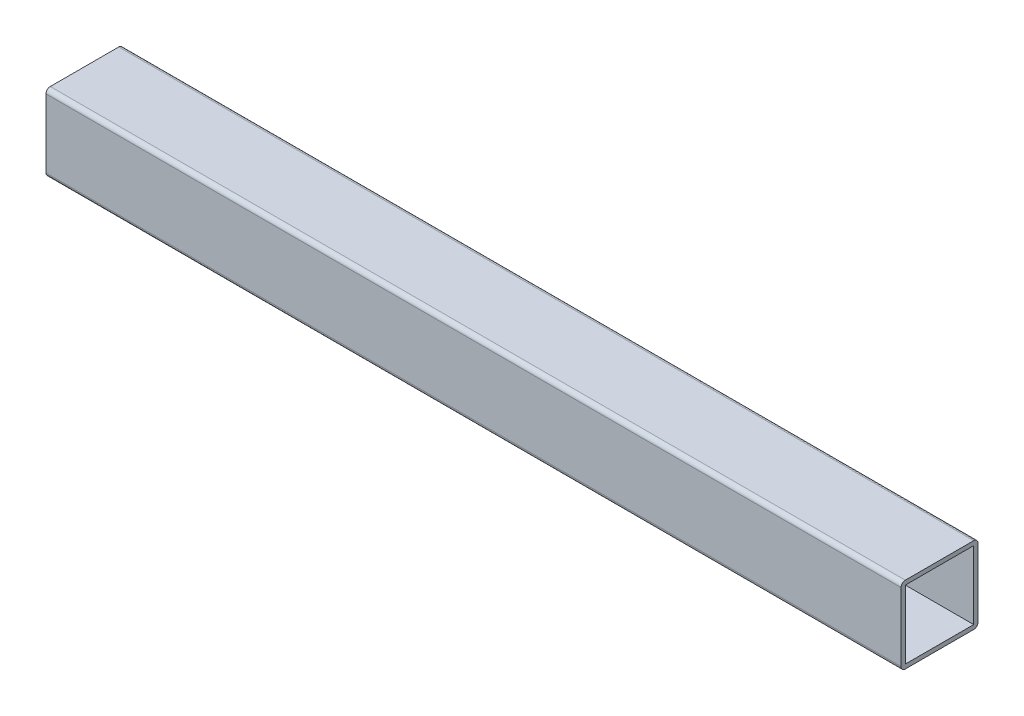
ISO-10303-21;
HEADER;
FILE_DESCRIPTION(('STEP AP214'),'2;1');
FILE_NAME('part.step','',(''),(''),'','','');
FILE_SCHEMA(('AUTOMOTIVE_DESIGN { 1 0 10303 214 1 1 1 1 }'));
ENDSEC;
DATA;
#1=APPLICATION_CONTEXT('core data for automotive mechanical design processes');
#2=APPLICATION_PROTOCOL_DEFINITION('international standard','automotive_design',2000,#1);
#3=PRODUCT_CONTEXT('',#1,'mechanical');
#4=PRODUCT('Part','Part','',(#3));
#5=PRODUCT_RELATED_PRODUCT_CATEGORY('part','',(#4));
#6=PRODUCT_DEFINITION_FORMATION('','',#4);
#7=PRODUCT_DEFINITION_CONTEXT('part definition',#1,'design');
#8=PRODUCT_DEFINITION('design','',#6,#7);
#9=PRODUCT_DEFINITION_SHAPE('','',#8);
#10=(LENGTH_UNIT() NAMED_UNIT(*) SI_UNIT(.MILLI.,.METRE.));
#11=(NAMED_UNIT(*) PLANE_ANGLE_UNIT() SI_UNIT($,.RADIAN.));
#12=(NAMED_UNIT(*) SI_UNIT($,.STERADIAN.) SOLID_ANGLE_UNIT());
#13=UNCERTAINTY_MEASURE_WITH_UNIT(LENGTH_MEASURE(1.E-05),#10,'distance_accuracy_value','');
#14=(GEOMETRIC_REPRESENTATION_CONTEXT(3) GLOBAL_UNCERTAINTY_ASSIGNED_CONTEXT((#13)) GLOBAL_UNIT_ASSIGNED_CONTEXT((#10,
#11,#12)) REPRESENTATION_CONTEXT('',''));
#15=CARTESIAN_POINT('',(0.,0.,0.));
#16=DIRECTION('',(0.,0.,1.));
#17=DIRECTION('',(1.,0.,0.));
#18=AXIS2_PLACEMENT_3D('',#15,#16,#17);
#19=CARTESIAN_POINT('',(2000.,170.,-10.));
#20=DIRECTION('',(-1.,0.,0.));
#21=DIRECTION('',(0.,0.,1.));
#22=AXIS2_PLACEMENT_3D('',#19,#20,#21);
#23=PLANE('',#22);
#24=CARTESIAN_POINT('',(2000.,170.,-10.));
#25=DIRECTION('',(1.,0.,0.));
#26=DIRECTION('',(0.,0.,1.));
#27=AXIS2_PLACEMENT_3D('',#24,#25,#26);
#28=CIRCLE('',#27,10.);
#29=CARTESIAN_POINT('',(2000.,180.,-10.));
#30=VERTEX_POINT('',#29);
#31=CARTESIAN_POINT('',(2000.,170.,0.));
#32=VERTEX_POINT('',#31);
#33=EDGE_CURVE('E173',#30,#32,#28,.T.);
#34=ORIENTED_EDGE('',*,*,#33,.T.);
#35=DIRECTION('',(0.,-1.,0.));
#36=VECTOR('',#35,1.);
#37=CARTESIAN_POINT('',(2000.,10.0000000000001,0.));
#38=LINE('',#37,#36);
#39=CARTESIAN_POINT('',(2000.,10.0000000000001,0.));
#40=VERTEX_POINT('',#39);
#41=EDGE_CURVE('E176',#32,#40,#38,.T.);
#42=ORIENTED_EDGE('',*,*,#41,.T.);
#43=CARTESIAN_POINT('',(2000.,10.,-10.));
#44=DIRECTION('',(1.,0.,0.));
#45=DIRECTION('',(0.,0.,1.));
#46=AXIS2_PLACEMENT_3D('',#43,#44,#45);
#47=CIRCLE('',#46,10.);
#48=CARTESIAN_POINT('',(2000.,0.,-10.0000000000001));
#49=VERTEX_POINT('',#48);
#50=EDGE_CURVE('E178',#40,#49,#47,.T.);
#51=ORIENTED_EDGE('',*,*,#50,.T.);
#52=DIRECTION('',(0.,0.,-1.));
#53=VECTOR('',#52,1.);
#54=CARTESIAN_POINT('',(2000.,0.,-10.0000000000001));
#55=LINE('',#54,#53);
#56=CARTESIAN_POINT('',(2000.,0.,-170.));
#57=VERTEX_POINT('',#56);
#58=EDGE_CURVE('E180',#49,#57,#55,.T.);
#59=ORIENTED_EDGE('',*,*,#58,.T.);
#60=CARTESIAN_POINT('',(2000.,10.,-170.));
#61=DIRECTION('',(1.,0.,0.));
#62=DIRECTION('',(0.,0.,-1.));
#63=AXIS2_PLACEMENT_3D('',#60,#61,#62);
#64=CIRCLE('',#63,10.);
#65=CARTESIAN_POINT('',(2000.,10.,-180.));
#66=VERTEX_POINT('',#65);
#67=EDGE_CURVE('E182',#57,#66,#64,.T.);
#68=ORIENTED_EDGE('',*,*,#67,.T.);
#69=DIRECTION('',(0.,1.,0.));
#70=VECTOR('',#69,1.);
#71=CARTESIAN_POINT('',(2000.,10.,-180.));
#72=LINE('',#71,#70);
#73=CARTESIAN_POINT('',(2000.,170.,-180.));
#74=VERTEX_POINT('',#73);
#75=EDGE_CURVE('E184',#66,#74,#72,.T.);
#76=ORIENTED_EDGE('',*,*,#75,.T.);
#77=CARTESIAN_POINT('',(2000.,170.,-170.));
#78=DIRECTION('',(1.,0.,0.));
#79=DIRECTION('',(0.,0.,-1.));
#80=AXIS2_PLACEMENT_3D('',#77,#78,#79);
#81=CIRCLE('',#80,10.);
#82=CARTESIAN_POINT('',(2000.,180.,-170.));
#83=VERTEX_POINT('',#82);
#84=EDGE_CURVE('E186',#74,#83,#81,.T.);
#85=ORIENTED_EDGE('',*,*,#84,.T.);
#86=DIRECTION('',(0.,0.,1.));
#87=VECTOR('',#86,1.);
#88=CARTESIAN_POINT('',(2000.,180.,-10.));
#89=LINE('',#88,#87);
#90=EDGE_CURVE('E188',#83,#30,#89,.T.);
#91=ORIENTED_EDGE('',*,*,#90,.T.);
#92=EDGE_LOOP('',(#34,#42,#51,#59,#68,#76,#85,#91));
#93=FACE_BOUND('',#92,.T.);
#94=DIRECTION('',(0.,0.,-1.));
#95=VECTOR('',#94,1.);
#96=CARTESIAN_POINT('',(2000.,10.,-10.));
#97=LINE('',#96,#95);
#98=CARTESIAN_POINT('',(2000.,10.,-10.));
#99=VERTEX_POINT('',#98);
#100=CARTESIAN_POINT('',(2000.,10.,-170.));
#101=VERTEX_POINT('',#100);
#102=EDGE_CURVE('E136',#99,#101,#97,.T.);
#103=ORIENTED_EDGE('',*,*,#102,.F.);
#104=DIRECTION('',(0.,-1.,0.));
#105=VECTOR('',#104,1.);
#106=CARTESIAN_POINT('',(2000.,10.,-10.));
#107=LINE('',#106,#105);
#108=CARTESIAN_POINT('',(2000.,170.,-10.));
#109=VERTEX_POINT('',#108);
#110=EDGE_CURVE('E151',#109,#99,#107,.T.);
#111=ORIENTED_EDGE('',*,*,#110,.F.);
#112=DIRECTION('',(0.,0.,1.));
#113=VECTOR('',#112,1.);
#114=CARTESIAN_POINT('',(2000.,170.,-10.));
#115=LINE('',#114,#113);
#116=CARTESIAN_POINT('',(2000.,170.,-170.));
#117=VERTEX_POINT('',#116);
#118=EDGE_CURVE('E149',#117,#109,#115,.T.);
#119=ORIENTED_EDGE('',*,*,#118,.F.);
#120=DIRECTION('',(0.,1.,0.));
#121=VECTOR('',#120,1.);
#122=CARTESIAN_POINT('',(2000.,10.,-170.));
#123=LINE('',#122,#121);
#124=EDGE_CURVE('E147',#101,#117,#123,.T.);
#125=ORIENTED_EDGE('',*,*,#124,.F.);
#126=EDGE_LOOP('',(#103,#111,#119,#125));
#127=FACE_BOUND('',#126,.T.);
#128=ADVANCED_FACE('F32',(#93,#127),#23,.F.);
#129=CARTESIAN_POINT('',(0.,170.,-10.));
#130=DIRECTION('',(-1.,0.,0.));
#131=DIRECTION('',(0.,0.,1.));
#132=AXIS2_PLACEMENT_3D('',#129,#130,#131);
#133=PLANE('',#132);
#134=CARTESIAN_POINT('',(0.,170.,-10.));
#135=DIRECTION('',(1.,0.,0.));
#136=DIRECTION('',(0.,0.,1.));
#137=AXIS2_PLACEMENT_3D('',#134,#135,#136);
#138=CIRCLE('',#137,10.);
#139=CARTESIAN_POINT('',(0.,180.,-10.));
#140=VERTEX_POINT('',#139);
#141=CARTESIAN_POINT('',(0.,170.,0.));
#142=VERTEX_POINT('',#141);
#143=EDGE_CURVE('E137',#140,#142,#138,.T.);
#144=ORIENTED_EDGE('',*,*,#143,.F.);
#145=DIRECTION('',(0.,0.,1.));
#146=VECTOR('',#145,1.);
#147=CARTESIAN_POINT('',(0.,180.,-10.));
#148=LINE('',#147,#146);
#149=CARTESIAN_POINT('',(0.,180.,-170.));
#150=VERTEX_POINT('',#149);
#151=EDGE_CURVE('E171',#150,#140,#148,.T.);
#152=ORIENTED_EDGE('',*,*,#151,.F.);
#153=CARTESIAN_POINT('',(0.,170.,-170.));
#154=DIRECTION('',(1.,0.,0.));
#155=DIRECTION('',(0.,0.,-1.));
#156=AXIS2_PLACEMENT_3D('',#153,#154,#155);
#157=CIRCLE('',#156,10.);
#158=CARTESIAN_POINT('',(0.,170.,-180.));
#159=VERTEX_POINT('',#158);
#160=EDGE_CURVE('E169',#159,#150,#157,.T.);
#161=ORIENTED_EDGE('',*,*,#160,.F.);
#162=DIRECTION('',(0.,1.,0.));
#163=VECTOR('',#162,1.);
#164=CARTESIAN_POINT('',(0.,10.,-180.));
#165=LINE('',#164,#163);
#166=CARTESIAN_POINT('',(0.,10.,-180.));
#167=VERTEX_POINT('',#166);
#168=EDGE_CURVE('E167',#167,#159,#165,.T.);
#169=ORIENTED_EDGE('',*,*,#168,.F.);
#170=CARTESIAN_POINT('',(0.,10.,-170.));
#171=DIRECTION('',(1.,0.,0.));
#172=DIRECTION('',(0.,0.,-1.));
#173=AXIS2_PLACEMENT_3D('',#170,#171,#172);
#174=CIRCLE('',#173,10.);
#175=CARTESIAN_POINT('',(0.,0.,-170.));
#176=VERTEX_POINT('',#175);
#177=EDGE_CURVE('E165',#176,#167,#174,.T.);
#178=ORIENTED_EDGE('',*,*,#177,.F.);
#179=DIRECTION('',(0.,0.,-1.));
#180=VECTOR('',#179,1.);
#181=CARTESIAN_POINT('',(0.,0.,-10.0000000000001));
#182=LINE('',#181,#180);
#183=CARTESIAN_POINT('',(0.,0.,-10.0000000000001));
#184=VERTEX_POINT('',#183);
#185=EDGE_CURVE('E163',#184,#176,#182,.T.);
#186=ORIENTED_EDGE('',*,*,#185,.F.);
#187=CARTESIAN_POINT('',(0.,10.,-10.));
#188=DIRECTION('',(1.,0.,0.));
#189=DIRECTION('',(0.,0.,1.));
#190=AXIS2_PLACEMENT_3D('',#187,#188,#189);
#191=CIRCLE('',#190,10.);
#192=CARTESIAN_POINT('',(0.,10.0000000000001,0.));
#193=VERTEX_POINT('',#192);
#194=EDGE_CURVE('E161',#193,#184,#191,.T.);
#195=ORIENTED_EDGE('',*,*,#194,.F.);
#196=DIRECTION('',(0.,-1.,0.));
#197=VECTOR('',#196,1.);
#198=CARTESIAN_POINT('',(0.,10.0000000000001,0.));
#199=LINE('',#198,#197);
#200=EDGE_CURVE('E159',#142,#193,#199,.T.);
#201=ORIENTED_EDGE('',*,*,#200,.F.);
#202=EDGE_LOOP('',(#144,#152,#161,#169,#178,#186,#195,#201));
#203=FACE_BOUND('',#202,.T.);
#204=DIRECTION('',(0.,-1.,0.));
#205=VECTOR('',#204,1.);
#206=CARTESIAN_POINT('',(0.,10.,-10.));
#207=LINE('',#206,#205);
#208=CARTESIAN_POINT('',(0.,170.,-10.));
#209=VERTEX_POINT('',#208);
#210=CARTESIAN_POINT('',(0.,10.,-10.));
#211=VERTEX_POINT('',#210);
#212=EDGE_CURVE('E141',#209,#211,#207,.T.);
#213=ORIENTED_EDGE('',*,*,#212,.T.);
#214=DIRECTION('',(0.,0.,-1.));
#215=VECTOR('',#214,1.);
#216=CARTESIAN_POINT('',(0.,10.,-10.));
#217=LINE('',#216,#215);
#218=CARTESIAN_POINT('',(0.,10.,-170.));
#219=VERTEX_POINT('',#218);
#220=EDGE_CURVE('E55',#211,#219,#217,.T.);
#221=ORIENTED_EDGE('',*,*,#220,.T.);
#222=DIRECTION('',(0.,1.,0.));
#223=VECTOR('',#222,1.);
#224=CARTESIAN_POINT('',(0.,10.,-170.));
#225=LINE('',#224,#223);
#226=CARTESIAN_POINT('',(0.,170.,-170.));
#227=VERTEX_POINT('',#226);
#228=EDGE_CURVE('E123',#219,#227,#225,.T.);
#229=ORIENTED_EDGE('',*,*,#228,.T.);
#230=DIRECTION('',(0.,0.,1.));
#231=VECTOR('',#230,1.);
#232=CARTESIAN_POINT('',(0.,170.,-10.));
#233=LINE('',#232,#231);
#234=EDGE_CURVE('E132',#227,#209,#233,.T.);
#235=ORIENTED_EDGE('',*,*,#234,.T.);
#236=EDGE_LOOP('',(#213,#221,#229,#235));
#237=FACE_BOUND('',#236,.T.);
#238=ADVANCED_FACE('F140',(#203,#237),#133,.T.);
#239=CARTESIAN_POINT('',(2000.,170.,-10.));
#240=DIRECTION('',(-1.,0.,0.));
#241=DIRECTION('',(0.,0.,1.));
#242=AXIS2_PLACEMENT_3D('',#239,#240,#241);
#243=CYLINDRICAL_SURFACE('',#242,10.);
#244=ORIENTED_EDGE('',*,*,#143,.T.);
#245=DIRECTION('',(-1.,0.,0.));
#246=VECTOR('',#245,1.);
#247=CARTESIAN_POINT('',(2000.,170.,0.));
#248=LINE('',#247,#246);
#249=EDGE_CURVE('E11',#32,#142,#248,.T.);
#250=ORIENTED_EDGE('',*,*,#249,.F.);
#251=ORIENTED_EDGE('',*,*,#33,.F.);
#252=DIRECTION('',(-1.,0.,0.));
#253=VECTOR('',#252,1.);
#254=CARTESIAN_POINT('',(2000.,180.,-10.));
#255=LINE('',#254,#253);
#256=EDGE_CURVE('E190',#30,#140,#255,.T.);
#257=ORIENTED_EDGE('',*,*,#256,.T.);
#258=EDGE_LOOP('',(#244,#250,#251,#257));
#259=FACE_BOUND('',#258,.T.);
#260=ADVANCED_FACE('F34',(#259),#243,.T.);
#261=CARTESIAN_POINT('',(2000.,10.0000000000001,0.));
#262=DIRECTION('',(0.,0.,-1.));
#263=DIRECTION('',(-1.,0.,0.));
#264=AXIS2_PLACEMENT_3D('',#261,#262,#263);
#265=PLANE('',#264);
#266=ORIENTED_EDGE('',*,*,#200,.T.);
#267=DIRECTION('',(-1.,0.,0.));
#268=VECTOR('',#267,1.);
#269=CARTESIAN_POINT('',(2000.,10.0000000000001,0.));
#270=LINE('',#269,#268);
#271=EDGE_CURVE('E40',#40,#193,#270,.T.);
#272=ORIENTED_EDGE('',*,*,#271,.F.);
#273=ORIENTED_EDGE('',*,*,#41,.F.);
#274=ORIENTED_EDGE('',*,*,#249,.T.);
#275=EDGE_LOOP('',(#266,#272,#273,#274));
#276=FACE_BOUND('',#275,.T.);
#277=ADVANCED_FACE('F234',(#276),#265,.F.);
#278=CARTESIAN_POINT('',(2000.,10.,-10.));
#279=DIRECTION('',(-1.,0.,0.));
#280=DIRECTION('',(0.,0.,1.));
#281=AXIS2_PLACEMENT_3D('',#278,#279,#280);
#282=CYLINDRICAL_SURFACE('',#281,10.);
#283=ORIENTED_EDGE('',*,*,#194,.T.);
#284=DIRECTION('',(-1.,0.,0.));
#285=VECTOR('',#284,1.);
#286=CARTESIAN_POINT('',(2000.,0.,-10.0000000000001));
#287=LINE('',#286,#285);
#288=EDGE_CURVE('E205',#49,#184,#287,.T.);
#289=ORIENTED_EDGE('',*,*,#288,.F.);
#290=ORIENTED_EDGE('',*,*,#50,.F.);
#291=ORIENTED_EDGE('',*,*,#271,.T.);
#292=EDGE_LOOP('',(#283,#289,#290,#291));
#293=FACE_BOUND('',#292,.T.);
#294=ADVANCED_FACE('F212',(#293),#282,.T.);
#295=CARTESIAN_POINT('',(2000.,0.,-10.0000000000001));
#296=DIRECTION('',(0.,1.,0.));
#297=DIRECTION('',(0.,0.,1.));
#298=AXIS2_PLACEMENT_3D('',#295,#296,#297);
#299=PLANE('',#298);
#300=ORIENTED_EDGE('',*,*,#185,.T.);
#301=DIRECTION('',(-1.,0.,0.));
#302=VECTOR('',#301,1.);
#303=CARTESIAN_POINT('',(2000.,0.,-170.));
#304=LINE('',#303,#302);
#305=EDGE_CURVE('E202',#57,#176,#304,.T.);
#306=ORIENTED_EDGE('',*,*,#305,.F.);
#307=ORIENTED_EDGE('',*,*,#58,.F.);
#308=ORIENTED_EDGE('',*,*,#288,.T.);
#309=EDGE_LOOP('',(#300,#306,#307,#308));
#310=FACE_BOUND('',#309,.T.);
#311=ADVANCED_FACE('F222',(#310),#299,.F.);
#312=CARTESIAN_POINT('',(2000.,10.,-170.));
#313=DIRECTION('',(-1.,0.,0.));
#314=DIRECTION('',(0.,0.,1.));
#315=AXIS2_PLACEMENT_3D('',#312,#313,#314);
#316=CYLINDRICAL_SURFACE('',#315,10.);
#317=ORIENTED_EDGE('',*,*,#177,.T.);
#318=DIRECTION('',(-1.,0.,0.));
#319=VECTOR('',#318,1.);
#320=CARTESIAN_POINT('',(2000.,10.,-180.));
#321=LINE('',#320,#319);
#322=EDGE_CURVE('E199',#66,#167,#321,.T.);
#323=ORIENTED_EDGE('',*,*,#322,.F.);
#324=ORIENTED_EDGE('',*,*,#67,.F.);
#325=ORIENTED_EDGE('',*,*,#305,.T.);
#326=EDGE_LOOP('',(#317,#323,#324,#325));
#327=FACE_BOUND('',#326,.T.);
#328=ADVANCED_FACE('F226',(#327),#316,.T.);
#329=CARTESIAN_POINT('',(2000.,10.,-180.));
#330=DIRECTION('',(0.,0.,1.));
#331=DIRECTION('',(1.,0.,0.));
#332=AXIS2_PLACEMENT_3D('',#329,#330,#331);
#333=PLANE('',#332);
#334=ORIENTED_EDGE('',*,*,#168,.T.);
#335=DIRECTION('',(-1.,0.,0.));
#336=VECTOR('',#335,1.);
#337=CARTESIAN_POINT('',(2000.,170.,-180.));
#338=LINE('',#337,#336);
#339=EDGE_CURVE('E196',#74,#159,#338,.T.);
#340=ORIENTED_EDGE('',*,*,#339,.F.);
#341=ORIENTED_EDGE('',*,*,#75,.F.);
#342=ORIENTED_EDGE('',*,*,#322,.T.);
#343=EDGE_LOOP('',(#334,#340,#341,#342));
#344=FACE_BOUND('',#343,.T.);
#345=ADVANCED_FACE('F247',(#344),#333,.F.);
#346=CARTESIAN_POINT('',(2000.,170.,-170.));
#347=DIRECTION('',(-1.,0.,0.));
#348=DIRECTION('',(0.,0.,1.));
#349=AXIS2_PLACEMENT_3D('',#346,#347,#348);
#350=CYLINDRICAL_SURFACE('',#349,10.);
#351=ORIENTED_EDGE('',*,*,#160,.T.);
#352=DIRECTION('',(-1.,0.,0.));
#353=VECTOR('',#352,1.);
#354=CARTESIAN_POINT('',(2000.,180.,-170.));
#355=LINE('',#354,#353);
#356=EDGE_CURVE('E193',#83,#150,#355,.T.);
#357=ORIENTED_EDGE('',*,*,#356,.F.);
#358=ORIENTED_EDGE('',*,*,#84,.F.);
#359=ORIENTED_EDGE('',*,*,#339,.T.);
#360=EDGE_LOOP('',(#351,#357,#358,#359));
#361=FACE_BOUND('',#360,.T.);
#362=ADVANCED_FACE('F245',(#361),#350,.T.);
#363=CARTESIAN_POINT('',(2000.,180.,-10.));
#364=DIRECTION('',(0.,-1.,0.));
#365=DIRECTION('',(0.,0.,-1.));
#366=AXIS2_PLACEMENT_3D('',#363,#364,#365);
#367=PLANE('',#366);
#368=ORIENTED_EDGE('',*,*,#151,.T.);
#369=ORIENTED_EDGE('',*,*,#256,.F.);
#370=ORIENTED_EDGE('',*,*,#90,.F.);
#371=ORIENTED_EDGE('',*,*,#356,.T.);
#372=EDGE_LOOP('',(#368,#369,#370,#371));
#373=FACE_BOUND('',#372,.T.);
#374=ADVANCED_FACE('F240',(#373),#367,.F.);
#375=CARTESIAN_POINT('',(2000.,10.,-10.));
#376=DIRECTION('',(0.,1.,0.));
#377=DIRECTION('',(0.,0.,1.));
#378=AXIS2_PLACEMENT_3D('',#375,#376,#377);
#379=PLANE('',#378);
#380=ORIENTED_EDGE('',*,*,#220,.F.);
#381=DIRECTION('',(-1.,0.,0.));
#382=VECTOR('',#381,1.);
#383=CARTESIAN_POINT('',(2000.,10.,-10.));
#384=LINE('',#383,#382);
#385=EDGE_CURVE('E153',#99,#211,#384,.T.);
#386=ORIENTED_EDGE('',*,*,#385,.F.);
#387=ORIENTED_EDGE('',*,*,#102,.T.);
#388=DIRECTION('',(-1.,0.,0.));
#389=VECTOR('',#388,1.);
#390=CARTESIAN_POINT('',(2000.,10.,-170.));
#391=LINE('',#390,#389);
#392=EDGE_CURVE('E125',#101,#219,#391,.T.);
#393=ORIENTED_EDGE('',*,*,#392,.T.);
#394=EDGE_LOOP('',(#380,#386,#387,#393));
#395=FACE_BOUND('',#394,.T.);
#396=ADVANCED_FACE('F134',(#395),#379,.T.);
#397=CARTESIAN_POINT('',(2000.,10.,-170.));
#398=DIRECTION('',(0.,0.,1.));
#399=DIRECTION('',(1.,0.,0.));
#400=AXIS2_PLACEMENT_3D('',#397,#398,#399);
#401=PLANE('',#400);
#402=ORIENTED_EDGE('',*,*,#228,.F.);
#403=ORIENTED_EDGE('',*,*,#392,.F.);
#404=ORIENTED_EDGE('',*,*,#124,.T.);
#405=DIRECTION('',(-1.,0.,0.));
#406=VECTOR('',#405,1.);
#407=CARTESIAN_POINT('',(2000.,170.,-170.));
#408=LINE('',#407,#406);
#409=EDGE_CURVE('E128',#117,#227,#408,.T.);
#410=ORIENTED_EDGE('',*,*,#409,.T.);
#411=EDGE_LOOP('',(#402,#403,#404,#410));
#412=FACE_BOUND('',#411,.T.);
#413=ADVANCED_FACE('F124',(#412),#401,.T.);
#414=CARTESIAN_POINT('',(2000.,170.,-10.));
#415=DIRECTION('',(0.,-1.,0.));
#416=DIRECTION('',(0.,0.,-1.));
#417=AXIS2_PLACEMENT_3D('',#414,#415,#416);
#418=PLANE('',#417);
#419=ORIENTED_EDGE('',*,*,#234,.F.);
#420=ORIENTED_EDGE('',*,*,#409,.F.);
#421=ORIENTED_EDGE('',*,*,#118,.T.);
#422=DIRECTION('',(-1.,0.,0.));
#423=VECTOR('',#422,1.);
#424=CARTESIAN_POINT('',(2000.,170.,-10.));
#425=LINE('',#424,#423);
#426=EDGE_CURVE('E47',#109,#209,#425,.T.);
#427=ORIENTED_EDGE('',*,*,#426,.T.);
#428=EDGE_LOOP('',(#419,#420,#421,#427));
#429=FACE_BOUND('',#428,.T.);
#430=ADVANCED_FACE('F271',(#429),#418,.T.);
#431=CARTESIAN_POINT('',(2000.,10.,-10.));
#432=DIRECTION('',(0.,0.,-1.));
#433=DIRECTION('',(0.,1.,0.));
#434=AXIS2_PLACEMENT_3D('',#431,#432,#433);
#435=PLANE('',#434);
#436=ORIENTED_EDGE('',*,*,#212,.F.);
#437=ORIENTED_EDGE('',*,*,#426,.F.);
#438=ORIENTED_EDGE('',*,*,#110,.T.);
#439=ORIENTED_EDGE('',*,*,#385,.T.);
#440=EDGE_LOOP('',(#436,#437,#438,#439));
#441=FACE_BOUND('',#440,.T.);
#442=ADVANCED_FACE('F276',(#441),#435,.T.);
#443=CLOSED_SHELL('',(#128,#238,#260,#277,#294,#311,#328,#345,#362,#374,#396,#413,#430,#442));
#444=MANIFOLD_SOLID_BREP('B2',#443);
#445=ADVANCED_BREP_SHAPE_REPRESENTATION('',(#18,#444),#14);
#446=SHAPE_DEFINITION_REPRESENTATION(#9,#445);
ENDSEC;
END-ISO-10303-21;
